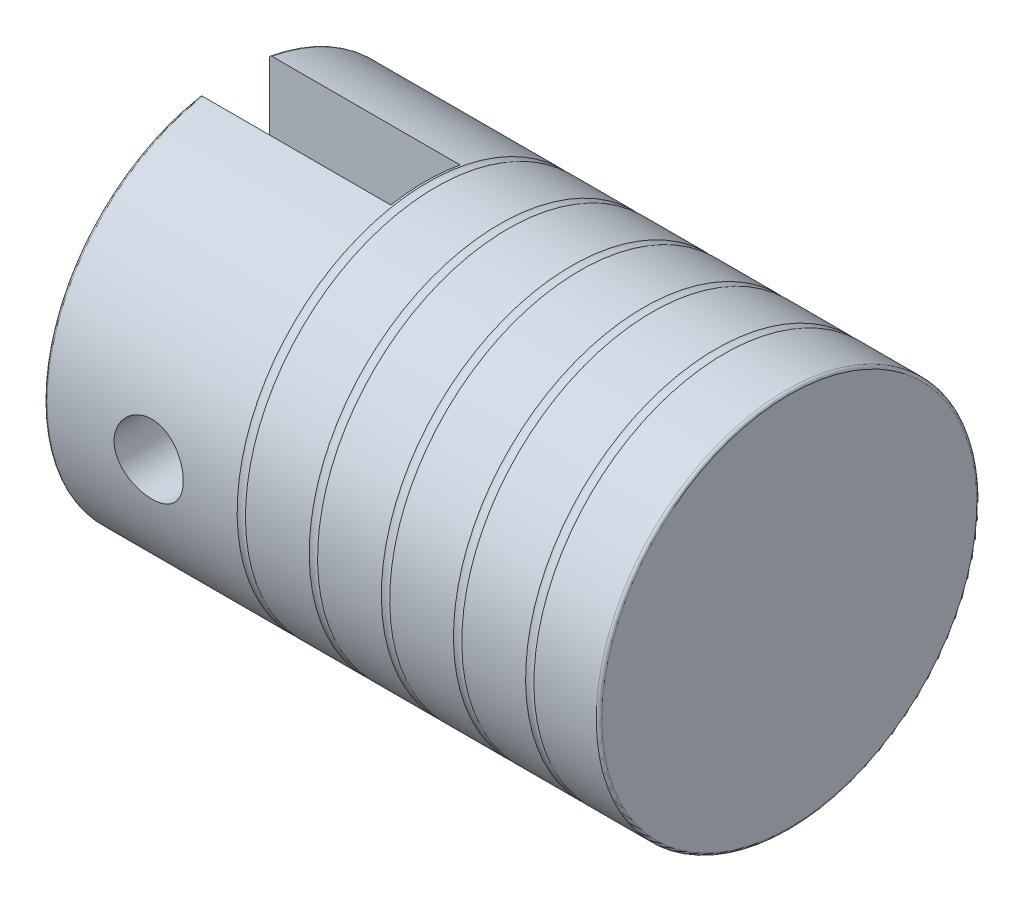
ISO-10303-21;
HEADER;
FILE_DESCRIPTION(('STEP AP214'),'2;1');
FILE_NAME('part.step','',(''),(''),'','','');
FILE_SCHEMA(('AUTOMOTIVE_DESIGN { 1 0 10303 214 1 1 1 1 }'));
ENDSEC;
DATA;
#1=APPLICATION_CONTEXT('core data for automotive mechanical design processes');
#2=APPLICATION_PROTOCOL_DEFINITION('international standard','automotive_design',2000,#1);
#3=PRODUCT_CONTEXT('',#1,'mechanical');
#4=PRODUCT('Part','Part','',(#3));
#5=PRODUCT_RELATED_PRODUCT_CATEGORY('part','',(#4));
#6=PRODUCT_DEFINITION_FORMATION('','',#4);
#7=PRODUCT_DEFINITION_CONTEXT('part definition',#1,'design');
#8=PRODUCT_DEFINITION('design','',#6,#7);
#9=PRODUCT_DEFINITION_SHAPE('','',#8);
#10=(LENGTH_UNIT() NAMED_UNIT(*) SI_UNIT(.MILLI.,.METRE.));
#11=(NAMED_UNIT(*) PLANE_ANGLE_UNIT() SI_UNIT($,.RADIAN.));
#12=(NAMED_UNIT(*) SI_UNIT($,.STERADIAN.) SOLID_ANGLE_UNIT());
#13=UNCERTAINTY_MEASURE_WITH_UNIT(LENGTH_MEASURE(1.E-05),#10,'distance_accuracy_value','');
#14=(GEOMETRIC_REPRESENTATION_CONTEXT(3) GLOBAL_UNCERTAINTY_ASSIGNED_CONTEXT((#13)) GLOBAL_UNIT_ASSIGNED_CONTEXT((#10,
#11,#12)) REPRESENTATION_CONTEXT('',''));
#15=CARTESIAN_POINT('',(0.,0.,0.));
#16=DIRECTION('',(0.,0.,1.));
#17=DIRECTION('',(1.,0.,0.));
#18=AXIS2_PLACEMENT_3D('',#15,#16,#17);
#19=CARTESIAN_POINT('',(0.,0.,0.));
#20=DIRECTION('',(-1.,0.,0.));
#21=DIRECTION('',(0.,-1.,0.));
#22=AXIS2_PLACEMENT_3D('',#19,#20,#21);
#23=CYLINDRICAL_SURFACE('',#22,8.71220000000004);
#24=CARTESIAN_POINT('',(6.35889,0.,8.71220000000004));
#25=CARTESIAN_POINT('',(6.35888657993912,-0.0881780350962883,8.71219842221285));
#26=CARTESIAN_POINT('',(6.35150063813652,-0.176401140000684,8.7108474397148));
#27=CARTESIAN_POINT('',(6.32216911079884,-0.350364612464317,8.70558828160361));
#28=CARTESIAN_POINT('',(6.30021092250165,-0.436102763873023,8.70167789253592));
#29=CARTESIAN_POINT('',(6.24242672621113,-0.602554988759746,8.6917376844555));
#30=CARTESIAN_POINT('',(6.20661290730397,-0.683273405956936,8.68570972873771));
#31=CARTESIAN_POINT('',(6.12216792701397,-0.837547426218977,8.67219392795744));
#32=CARTESIAN_POINT('',(6.07353792454137,-0.911103676103451,8.66470621491021));
#33=CARTESIAN_POINT('',(5.964257990526,-1.04980387004279,8.64900388999731));
#34=CARTESIAN_POINT('',(5.90349152990364,-1.1148552669263,8.64078269565771));
#35=CARTESIAN_POINT('',(5.77191434182633,-1.23389889424259,8.6245892741744));
#36=CARTESIAN_POINT('',(5.70110291944321,-1.28789035889764,8.61661706430246));
#37=CARTESIAN_POINT('',(5.5507970173867,-1.38366245615154,8.60176036132886));
#38=CARTESIAN_POINT('',(5.47124211266623,-1.42534969012656,8.59488436147924));
#39=CARTESIAN_POINT('',(5.30611243032872,-1.49473226319188,8.58309097778229));
#40=CARTESIAN_POINT('',(5.22053813995583,-1.52242873329475,8.57817343562017));
#41=CARTESIAN_POINT('',(5.0467865365023,-1.56274808974622,8.57091981410445));
#42=CARTESIAN_POINT('',(4.95864774445936,-1.57553192603814,8.56855619157597));
#43=CARTESIAN_POINT('',(4.78144698268107,-1.58616255242033,8.56659491393983));
#44=CARTESIAN_POINT('',(4.6923850913385,-1.58401060069801,8.5669970258473));
#45=CARTESIAN_POINT('',(4.51702740126921,-1.56496141430328,8.57049668583428));
#46=CARTESIAN_POINT('',(4.4307110272405,-1.54824655987175,8.57356089349336));
#47=CARTESIAN_POINT('',(4.26212844974995,-1.50083297563626,8.58198717001298));
#48=CARTESIAN_POINT('',(4.17986240912802,-1.47013368410886,8.58734933117665));
#49=CARTESIAN_POINT('',(4.02117856943023,-1.3954424442769,8.59980252056464));
#50=CARTESIAN_POINT('',(3.94479649912633,-1.35137625774107,8.60690316049756));
#51=CARTESIAN_POINT('',(3.80044191774612,-1.25125466567014,8.62202680162168));
#52=CARTESIAN_POINT('',(3.73247021140459,-1.19519811425066,8.63004989093478));
#53=CARTESIAN_POINT('',(3.60581150866763,-1.07170074561807,8.64626005911602));
#54=CARTESIAN_POINT('',(3.547276731459,-1.00410379139383,8.65444780819194));
#55=CARTESIAN_POINT('',(3.44235569908062,-0.859968503234779,8.66995549589927));
#56=CARTESIAN_POINT('',(3.39596955223443,-0.783430089582038,8.67727542679244));
#57=CARTESIAN_POINT('',(3.31664255588323,-0.623430227827684,8.69023617958309));
#58=CARTESIAN_POINT('',(3.2837168551586,-0.539961106061651,8.69587510770943));
#59=CARTESIAN_POINT('',(3.23239566095612,-0.36855170612559,8.70482372402951));
#60=CARTESIAN_POINT('',(3.2139987181022,-0.280611874881426,8.7081336445594));
#61=CARTESIAN_POINT('',(3.19246755367666,-0.104067618494153,8.71201958636721));
#62=CARTESIAN_POINT('',(3.18912465553183,-0.0154894387620692,8.71263298352303));
#63=CARTESIAN_POINT('',(3.19723769545246,0.16096046704421,8.71115975916051));
#64=CARTESIAN_POINT('',(3.2086929518233,0.248832225472917,8.70907326201602));
#65=CARTESIAN_POINT('',(3.24590360312871,0.42071798931342,8.70245792234148));
#66=CARTESIAN_POINT('',(3.27155405805748,0.504755462696955,8.69794700961787));
#67=CARTESIAN_POINT('',(3.33631390779904,0.667337235263273,8.68698652691297));
#68=CARTESIAN_POINT('',(3.37542417292065,0.745881178840195,8.68053683157375));
#69=CARTESIAN_POINT('',(3.46645989012655,0.896141446901156,8.66632103390036));
#70=CARTESIAN_POINT('',(3.51851366583025,0.967778778987808,8.65854200987678));
#71=CARTESIAN_POINT('',(3.63378433035608,1.10137632489634,8.64256525295958));
#72=CARTESIAN_POINT('',(3.69700219473423,1.16333569213238,8.63436748351908));
#73=CARTESIAN_POINT('',(3.83374879869752,1.27660593245484,8.61835406808897));
#74=CARTESIAN_POINT('',(3.90739599452875,1.32777478868893,8.61054444248161));
#75=CARTESIAN_POINT('',(4.06236316494509,1.41701492961941,8.59631014426014));
#76=CARTESIAN_POINT('',(4.14368286522168,1.45508668233948,8.58988542215971));
#77=CARTESIAN_POINT('',(4.31131571098341,1.5168473628361,8.57919502348117));
#78=CARTESIAN_POINT('',(4.39760362017968,1.54060297761762,8.57491935197545));
#79=CARTESIAN_POINT('',(4.57303049144875,1.57326400404161,8.56898766486009));
#80=CARTESIAN_POINT('',(4.66216915229242,1.58217097943932,8.56733137339654));
#81=CARTESIAN_POINT('',(4.83934599340483,1.58483203204447,8.56683937749146));
#82=CARTESIAN_POINT('',(4.92738077412237,1.5788099773209,8.56796200148462));
#83=CARTESIAN_POINT('',(5.10116123851881,1.55227230843146,8.57280925004439));
#84=CARTESIAN_POINT('',(5.18690693396287,1.53175676877241,8.57653386123493));
#85=CARTESIAN_POINT('',(5.35356444936173,1.476906512074,8.58614834889876));
#86=CARTESIAN_POINT('',(5.43448400260603,1.44259462457345,8.592034646928));
#87=CARTESIAN_POINT('',(5.58945389617563,1.36114968000174,8.60531204502652));
#88=CARTESIAN_POINT('',(5.66350379140644,1.3140157929527,8.6127032425013));
#89=CARTESIAN_POINT('',(5.80375657571704,1.20748057090452,8.62828779013409));
#90=CARTESIAN_POINT('',(5.86983423803703,1.1479157874098,8.63649097295868));
#91=CARTESIAN_POINT('',(5.99113166050738,1.01855168131829,8.65270027657516));
#92=CARTESIAN_POINT('',(6.04634892114377,0.948750009146274,8.66070635163279));
#93=CARTESIAN_POINT('',(6.14478833300657,0.80019350002951,8.67569789672113));
#94=CARTESIAN_POINT('',(6.18790600375019,0.721368486827742,8.68267424436409));
#95=CARTESIAN_POINT('',(6.26021847648167,0.557493868511521,8.69473138736662));
#96=CARTESIAN_POINT('',(6.28942658336653,0.472450301828954,8.69981399312763));
#97=CARTESIAN_POINT('',(6.32704238762218,0.322610596062289,8.70645373872986));
#98=CARTESIAN_POINT('',(6.33896520496152,0.25869968057524,8.70859660586296));
#99=CARTESIAN_POINT('',(6.35489018002525,0.129867311085733,8.71147030138847));
#100=CARTESIAN_POINT('',(6.35889251898179,0.064945880239606,8.71220116208964));
#101=CARTESIAN_POINT('',(6.35889,0.,8.71220000000004));
#102=B_SPLINE_CURVE_WITH_KNOTS('',3,(#24,#25,#26,#27,#28,#29,#30,#31,#32,#33,#34,#35,#36,#37,
#38,#39,#40,#41,#42,#43,#44,#45,#46,#47,#48,#49,#50,#51,#52,#53,#54,#55,#56,#57,#58,#59,#60,#61,
#62,#63,#64,#65,#66,#67,#68,#69,#70,#71,#72,#73,#74,#75,#76,#77,#78,#79,#80,#81,#82,#83,#84,#85,
#86,#87,#88,#89,#90,#91,#92,#93,#94,#95,#96,#97,#98,#99,#100,#101),.UNSPECIFIED.,.T.,.F.,(4,2,2,
2,2,2,2,2,2,2,2,2,2,2,2,2,2,2,2,2,2,2,2,2,2,2,2,2,2,2,2,2,2,2,2,2,2,2,4),(0.,0.264296627695332,
0.52882212990661,0.793115450757916,1.05738488093976,1.3243255523839,1.59128470026875,
1.86022102624334,2.12913560793972,2.39512016367275,2.66108231319878,2.92376076877578,
3.18644977648712,3.45062530495584,3.71482609120244,3.98293510683311,4.25104651298281,
4.51945883435895,4.78784437577523,5.05249791681089,5.31713926670016,5.57984985891462,
5.84257744113974,6.10802154086702,6.37348884748954,6.6422577213408,6.91101698976578,
7.17851445530048,7.4459837480862,7.70946653886673,7.97294797516844,8.23599519754972,
8.49905945123305,8.76582925955849,9.03266039311265,9.30172930351162,9.5705403222379,
9.7652075076045,9.95987023864936),.UNSPECIFIED.);
#103=CARTESIAN_POINT('',(6.35889,0.,8.71220000000004));
#104=VERTEX_POINT('',#103);
#105=EDGE_CURVE('E231',#104,#104,#102,.T.);
#106=ORIENTED_EDGE('',*,*,#105,.T.);
#107=EDGE_LOOP('',(#106));
#108=FACE_BOUND('',#107,.T.);
#109=CARTESIAN_POINT('',(8.82650000000008,0.,0.));
#110=DIRECTION('',(-1.,0.,0.));
#111=DIRECTION('',(0.,-1.,0.));
#112=AXIS2_PLACEMENT_3D('',#109,#110,#111);
#113=CIRCLE('',#112,8.7122);
#114=CARTESIAN_POINT('',(8.82650000000014,-8.71219999999994,0.));
#115=VERTEX_POINT('',#114);
#116=EDGE_CURVE('E244',#115,#115,#113,.T.);
#117=ORIENTED_EDGE('',*,*,#116,.T.);
#118=EDGE_LOOP('',(#117));
#119=FACE_BOUND('',#118,.T.);
#120=CARTESIAN_POINT('',(3.175,0.,-8.71220000000015));
#121=CARTESIAN_POINT('',(3.17500343859348,-0.0890810154218983,-8.71219839925246));
#122=CARTESIAN_POINT('',(3.18246366863994,-0.178207155163992,-8.71081960810333));
#123=CARTESIAN_POINT('',(3.21208957475638,-0.353950177902064,-8.70545220781347));
#124=CARTESIAN_POINT('',(3.23426787550828,-0.440564840006631,-8.70146135817439));
#125=CARTESIAN_POINT('',(3.29262978627273,-0.608717667290271,-8.69131649876752));
#126=CARTESIAN_POINT('',(3.32880097521795,-0.690260260484486,-8.68516440791258));
#127=CARTESIAN_POINT('',(3.41408714680375,-0.846111183762068,-8.67136975487537));
#128=CARTESIAN_POINT('',(3.46320099939333,-0.920420144653674,-8.66372732283303));
#129=CARTESIAN_POINT('',(3.57357881985417,-1.06055804140212,-8.64769784853599));
#130=CARTESIAN_POINT('',(3.63496284447047,-1.12629164075717,-8.63930394120116));
#131=CARTESIAN_POINT('',(3.76788024496405,-1.24658835536192,-8.62276881644721));
#132=CARTESIAN_POINT('',(3.83941433156841,-1.30115068772363,-8.61462761677186));
#133=CARTESIAN_POINT('',(3.99127143843675,-1.39794982342224,-8.59945301682811));
#134=CARTESIAN_POINT('',(4.07165691181394,-1.44009016144301,-8.59242847234932));
#135=CARTESIAN_POINT('',(4.23851685811677,-1.51023169532757,-8.58037899504125));
#136=CARTESIAN_POINT('',(4.3249908274154,-1.53823405909154,-8.57535389705033));
#137=CARTESIAN_POINT('',(4.50055474740938,-1.57899984928511,-8.56794123769347));
#138=CARTESIAN_POINT('',(4.58960492837745,-1.59192922862983,-8.56552497545905));
#139=CARTESIAN_POINT('',(4.76864094310367,-1.60269703294244,-8.56351698355482));
#140=CARTESIAN_POINT('',(4.85862669571746,-1.60053675594777,-8.56392501093488));
#141=CARTESIAN_POINT('',(5.03578059823769,-1.58132125246994,-8.56749335093391));
#142=CARTESIAN_POINT('',(5.12296997282163,-1.56445429120521,-8.5706188745414));
#143=CARTESIAN_POINT('',(5.2932599936348,-1.51660050046416,-8.57921543206865));
#144=CARTESIAN_POINT('',(5.37636047234542,-1.48561309301788,-8.58468656199687));
#145=CARTESIAN_POINT('',(5.53666708305662,-1.4102126221209,-8.59739447463255));
#146=CARTESIAN_POINT('',(5.61383643927297,-1.36572312668345,-8.60464126269567));
#147=CARTESIAN_POINT('',(5.75968556027491,-1.26463546770606,-8.6200772844391));
#148=CARTESIAN_POINT('',(5.82836449614467,-1.20803612335785,-8.62826660998843));
#149=CARTESIAN_POINT('',(5.95637137683152,-1.08331830903141,-8.6448168101471));
#150=CARTESIAN_POINT('',(6.01554235288752,-1.01503871162569,-8.65317840717349));
#151=CARTESIAN_POINT('',(6.12161322507292,-0.869438865819215,-8.66901717025059));
#152=CARTESIAN_POINT('',(6.16851300741391,-0.792118533595103,-8.67649432809971));
#153=CARTESIAN_POINT('',(6.24873159407329,-0.630471428166474,-8.68973592347503));
#154=CARTESIAN_POINT('',(6.28203454596097,-0.546136613885513,-8.69549835971218));
#155=CARTESIAN_POINT('',(6.33395793664999,-0.372940581433076,-8.7046456762418));
#156=CARTESIAN_POINT('',(6.35257987118779,-0.28407982535748,-8.70803079873672));
#157=CARTESIAN_POINT('',(6.37439523003346,-0.105705267904563,-8.71200894228315));
#158=CARTESIAN_POINT('',(6.37780380384423,-0.0162186192013688,-8.7126408959544));
#159=CARTESIAN_POINT('',(6.36967212498367,0.162046138454502,-8.71114886674343));
#160=CARTESIAN_POINT('',(6.358132575926,0.250824280558941,-8.70902501357804));
#161=CARTESIAN_POINT('',(6.32061111364298,0.42447294502914,-8.70228422363697));
#162=CARTESIAN_POINT('',(6.29473761537771,0.50936768337674,-8.69768600911504));
#163=CARTESIAN_POINT('',(6.22939969324541,0.673614387275542,-8.68650993958429));
#164=CARTESIAN_POINT('',(6.18993437598368,0.752965988062002,-8.67993195444809));
#165=CARTESIAN_POINT('',(6.09805372824825,0.904795273267943,-8.6654289166878));
#166=CARTESIAN_POINT('',(6.04550636915819,0.977191747912077,-8.65749040473461));
#167=CARTESIAN_POINT('',(5.92913248480874,1.11221633553097,-8.64118264336408));
#168=CARTESIAN_POINT('',(5.86530495176578,1.17484357476916,-8.63281335550812));
#169=CARTESIAN_POINT('',(5.72721020750247,1.28936564749491,-8.61645877464645));
#170=CARTESIAN_POINT('',(5.65282059782916,1.341113925544,-8.60847971565279));
#171=CARTESIAN_POINT('',(5.4962780236366,1.43138005601803,-8.59393268753321));
#172=CARTESIAN_POINT('',(5.41412534040118,1.46989838757689,-8.58736466730854));
#173=CARTESIAN_POINT('',(5.24476792166285,1.53240123783056,-8.57643189043931));
#174=CARTESIAN_POINT('',(5.15758908266361,1.55645403402787,-8.57205679971674));
#175=CARTESIAN_POINT('',(4.98034000640754,1.5895545053612,-8.56598117585487));
#176=CARTESIAN_POINT('',(4.89027008178702,1.59860379741149,-8.56428035451297));
#177=CARTESIAN_POINT('',(4.71126266980922,1.60138799244302,-8.5637600454378));
#178=CARTESIAN_POINT('',(4.62232882026598,1.59535396783307,-8.56489708205878));
#179=CARTESIAN_POINT('',(4.44676586649087,1.56864751058773,-8.56982818631066));
#180=CARTESIAN_POINT('',(4.36013674979423,1.54797515713801,-8.57362223956851));
#181=CARTESIAN_POINT('',(4.1917599507834,1.49267466488985,-8.58342191276151));
#182=CARTESIAN_POINT('',(4.11000413595306,1.45807056895916,-8.58942372110486));
#183=CARTESIAN_POINT('',(3.95342154483761,1.37591382306021,-8.60296552049258));
#184=CARTESIAN_POINT('',(3.87859523104966,1.32836030963971,-8.61050561409963));
#185=CARTESIAN_POINT('',(3.73683624869438,1.22084713504989,-8.62640992000747));
#186=CARTESIAN_POINT('',(3.67003253158836,1.16071894204314,-8.63478442202249));
#187=CARTESIAN_POINT('',(3.54738558168418,1.03011552828716,-8.65133601257922));
#188=CARTESIAN_POINT('',(3.49154487132264,0.959637932788239,-8.6595130553096));
#189=CARTESIAN_POINT('',(3.39196274219659,0.809612127980677,-8.67483059841685));
#190=CARTESIAN_POINT('',(3.34832934039479,0.729991224375814,-8.68196159480117));
#191=CARTESIAN_POINT('',(3.27512764415302,0.564444856476086,-8.69429089665788));
#192=CARTESIAN_POINT('',(3.24554598414575,0.478525473270183,-8.69949103766585));
#193=CARTESIAN_POINT('',(3.20737414030399,0.326947627520998,-8.70629807029575));
#194=CARTESIAN_POINT('',(3.19525433051983,0.262181630303912,-8.70849892510214));
#195=CARTESIAN_POINT('',(3.17906608537998,0.131618617885182,-8.71145046416571));
#196=CARTESIAN_POINT('',(3.17499745923621,0.0658216271521276,-8.7122011827866));
#197=CARTESIAN_POINT('',(3.175,0.,-8.71220000000015));
#198=B_SPLINE_CURVE_WITH_KNOTS('',3,(#120,#121,#122,#123,#124,#125,#126,#127,#128,#129,#130,
#131,#132,#133,#134,#135,#136,#137,#138,#139,#140,#141,#142,#143,#144,#145,#146,#147,#148,#149,
#150,#151,#152,#153,#154,#155,#156,#157,#158,#159,#160,#161,#162,#163,#164,#165,#166,#167,#168,
#169,#170,#171,#172,#173,#174,#175,#176,#177,#178,#179,#180,#181,#182,#183,#184,#185,#186,#187,
#188,#189,#190,#191,#192,#193,#194,#195,#196,#197),.UNSPECIFIED.,.T.,.F.,(4,2,2,2,2,2,2,2,2,2,2,
2,2,2,2,2,2,2,2,2,2,2,2,2,2,2,2,2,2,2,2,2,2,2,2,2,2,2,4),(0.,0.267002355289124,
0.534234033046128,0.801229039559466,1.06820074190067,1.33792515423079,1.60766846251778,
1.87945443262966,2.15121794755603,2.41996022293412,2.68867938093745,2.95400825763615,
3.21934799559922,3.48621869536859,3.75311542905994,4.02404485687404,4.29497679687513,
4.56622371827456,4.83744300082924,5.1048142536373,5.37217292163914,5.63753649523329,
5.90291751459154,6.17109389232241,6.43929424135885,6.71090405880369,6.98250403862717,
7.25281179136189,7.52309041137688,7.78925388723672,8.0554159233031,8.32112058267792,
8.58684296327333,8.85638558334575,9.12599014896063,9.39790986768553,9.669570424588,
9.86686213564486,10.0641491714441),.UNSPECIFIED.);
#199=CARTESIAN_POINT('',(3.175,0.,-8.71220000000015));
#200=VERTEX_POINT('',#199);
#201=EDGE_CURVE('E123',#200,#200,#198,.T.);
#202=ORIENTED_EDGE('',*,*,#201,.T.);
#203=EDGE_LOOP('',(#202));
#204=FACE_BOUND('',#203,.T.);
#205=DIRECTION('',(-1.,0.,0.));
#206=VECTOR('',#205,1.);
#207=CARTESIAN_POINT('',(0.,-8.56634534617889,-1.5875));
#208=LINE('',#207,#206);
#209=CARTESIAN_POINT('',(8.7376,-8.56634534617883,-1.5875));
#210=VERTEX_POINT('',#209);
#211=CARTESIAN_POINT('',(0.127000000000091,-8.56634534617889,-1.5875));
#212=VERTEX_POINT('',#211);
#213=EDGE_CURVE('E93',#210,#212,#208,.T.);
#214=ORIENTED_EDGE('',*,*,#213,.T.);
#215=CARTESIAN_POINT('',(0.127000000000031,0.,0.));
#216=DIRECTION('',(-1.,0.,0.));
#217=DIRECTION('',(0.,-1.,0.));
#218=AXIS2_PLACEMENT_3D('',#215,#216,#217);
#219=CIRCLE('',#218,8.71220000000004);
#220=CARTESIAN_POINT('',(0.126999999999971,8.56634534617889,-1.5875));
#221=VERTEX_POINT('',#220);
#222=EDGE_CURVE('E316',#212,#221,#219,.F.);
#223=ORIENTED_EDGE('',*,*,#222,.T.);
#224=DIRECTION('',(-1.,0.,0.));
#225=VECTOR('',#224,1.);
#226=CARTESIAN_POINT('',(0.,8.56634534617889,-1.5875));
#227=LINE('',#226,#225);
#228=CARTESIAN_POINT('',(8.7376,8.56634534617895,-1.5875));
#229=VERTEX_POINT('',#228);
#230=EDGE_CURVE('E103',#221,#229,#227,.F.);
#231=ORIENTED_EDGE('',*,*,#230,.T.);
#232=CARTESIAN_POINT('',(8.7376,0.,0.));
#233=DIRECTION('',(1.,0.,0.));
#234=DIRECTION('',(0.,0.,-1.));
#235=AXIS2_PLACEMENT_3D('',#232,#233,#234);
#236=CIRCLE('',#235,8.71220000000004);
#237=CARTESIAN_POINT('',(8.7376,8.56634534617895,1.5875));
#238=VERTEX_POINT('',#237);
#239=EDGE_CURVE('E114',#238,#229,#236,.F.);
#240=ORIENTED_EDGE('',*,*,#239,.F.);
#241=DIRECTION('',(-1.,0.,0.));
#242=VECTOR('',#241,1.);
#243=CARTESIAN_POINT('',(0.,8.56634534617889,1.5875));
#244=LINE('',#243,#242);
#245=CARTESIAN_POINT('',(0.126999999999971,8.56634534617889,1.5875));
#246=VERTEX_POINT('',#245);
#247=EDGE_CURVE('E319',#238,#246,#244,.T.);
#248=ORIENTED_EDGE('',*,*,#247,.T.);
#249=CARTESIAN_POINT('',(0.127000000000031,0.,0.));
#250=DIRECTION('',(-1.,0.,0.));
#251=DIRECTION('',(0.,-1.,0.));
#252=AXIS2_PLACEMENT_3D('',#249,#250,#251);
#253=CIRCLE('',#252,8.71220000000004);
#254=CARTESIAN_POINT('',(0.127000000000091,-8.56634534617889,1.5875));
#255=VERTEX_POINT('',#254);
#256=EDGE_CURVE('E317',#246,#255,#253,.F.);
#257=ORIENTED_EDGE('',*,*,#256,.T.);
#258=DIRECTION('',(-1.,0.,0.));
#259=VECTOR('',#258,1.);
#260=CARTESIAN_POINT('',(0.,-8.56634534617889,1.5875));
#261=LINE('',#260,#259);
#262=CARTESIAN_POINT('',(8.7376,-8.56634534617883,1.5875));
#263=VERTEX_POINT('',#262);
#264=EDGE_CURVE('E117',#255,#263,#261,.F.);
#265=ORIENTED_EDGE('',*,*,#264,.T.);
#266=EDGE_CURVE('E111',#210,#263,#236,.F.);
#267=ORIENTED_EDGE('',*,*,#266,.F.);
#268=EDGE_LOOP('',(#214,#223,#231,#240,#248,#257,#265,#267));
#269=FACE_BOUND('',#268,.T.);
#270=ADVANCED_FACE('F35',(#108,#119,#204,#269),#23,.T.);
#271=CARTESIAN_POINT('',(0.,0.,0.));
#272=DIRECTION('',(-1.,0.,0.));
#273=DIRECTION('',(0.,-1.,0.));
#274=AXIS2_PLACEMENT_3D('',#271,#272,#273);
#275=PLANE('',#274);
#276=DIRECTION('',(0.,-1.,0.));
#277=VECTOR('',#276,1.);
#278=CARTESIAN_POINT('',(0.,-12.6999999999999,1.5875));
#279=LINE('',#278,#277);
#280=CARTESIAN_POINT('',(0.,8.43715015808067,1.5875));
#281=VERTEX_POINT('',#280);
#282=CARTESIAN_POINT('',(0.,-8.43715015808067,1.5875));
#283=VERTEX_POINT('',#282);
#284=EDGE_CURVE('E321',#281,#283,#279,.T.);
#285=ORIENTED_EDGE('',*,*,#284,.T.);
#286=CARTESIAN_POINT('',(0.,0.,0.));
#287=DIRECTION('',(-1.,0.,0.));
#288=DIRECTION('',(0.,-1.,0.));
#289=AXIS2_PLACEMENT_3D('',#286,#287,#288);
#290=CIRCLE('',#289,8.58520000000004);
#291=EDGE_CURVE('E314',#283,#281,#290,.T.);
#292=ORIENTED_EDGE('',*,*,#291,.T.);
#293=EDGE_LOOP('',(#285,#292));
#294=FACE_BOUND('',#293,.T.);
#295=ADVANCED_FACE('F204',(#294),#275,.T.);
#296=DIRECTION('',(0.,1.,0.));
#297=VECTOR('',#296,1.);
#298=CARTESIAN_POINT('',(0.,-12.6999999999999,-1.5875));
#299=LINE('',#298,#297);
#300=CARTESIAN_POINT('',(0.,-8.43715015808067,-1.5875));
#301=VERTEX_POINT('',#300);
#302=CARTESIAN_POINT('',(0.,8.43715015808067,-1.5875));
#303=VERTEX_POINT('',#302);
#304=EDGE_CURVE('E322',#301,#303,#299,.T.);
#305=ORIENTED_EDGE('',*,*,#304,.T.);
#306=CARTESIAN_POINT('',(0.,0.,0.));
#307=DIRECTION('',(-1.,0.,0.));
#308=DIRECTION('',(0.,-1.,0.));
#309=AXIS2_PLACEMENT_3D('',#306,#307,#308);
#310=CIRCLE('',#309,8.58520000000004);
#311=EDGE_CURVE('E130',#303,#301,#310,.T.);
#312=ORIENTED_EDGE('',*,*,#311,.T.);
#313=EDGE_LOOP('',(#305,#312));
#314=FACE_BOUND('',#313,.T.);
#315=ADVANCED_FACE('F218',(#314),#275,.T.);
#316=CARTESIAN_POINT('',(4.7752,0.,5.08));
#317=DIRECTION('',(0.,0.,-1.));
#318=DIRECTION('',(-1.,0.,0.));
#319=AXIS2_PLACEMENT_3D('',#316,#317,#318);
#320=CYLINDRICAL_SURFACE('',#319,1.6002);
#321=CARTESIAN_POINT('',(4.7752,0.,5.08));
#322=DIRECTION('',(0.,0.,1.));
#323=DIRECTION('',(1.,0.,0.));
#324=AXIS2_PLACEMENT_3D('',#321,#322,#323);
#325=CIRCLE('',#324,1.6002);
#326=CARTESIAN_POINT('',(6.3754,0.,5.08));
#327=VERTEX_POINT('',#326);
#328=EDGE_CURVE('E241',#327,#327,#325,.T.);
#329=ORIENTED_EDGE('',*,*,#328,.T.);
#330=EDGE_LOOP('',(#329));
#331=FACE_BOUND('',#330,.T.);
#332=CARTESIAN_POINT('',(4.7752,0.,1.5875));
#333=DIRECTION('',(0.,0.,-1.));
#334=DIRECTION('',(-1.,0.,0.));
#335=AXIS2_PLACEMENT_3D('',#332,#333,#334);
#336=CIRCLE('',#335,1.6002);
#337=CARTESIAN_POINT('',(3.175,0.,1.5875));
#338=VERTEX_POINT('',#337);
#339=EDGE_CURVE('E125',#338,#338,#336,.T.);
#340=ORIENTED_EDGE('',*,*,#339,.T.);
#341=EDGE_LOOP('',(#340));
#342=FACE_BOUND('',#341,.T.);
#343=ADVANCED_FACE('F214',(#331,#342),#320,.F.);
#344=ORIENTED_EDGE('',*,*,#201,.F.);
#345=EDGE_LOOP('',(#344));
#346=FACE_BOUND('',#345,.T.);
#347=CARTESIAN_POINT('',(4.7752,0.,-1.5875));
#348=DIRECTION('',(0.,0.,1.));
#349=DIRECTION('',(1.,0.,0.));
#350=AXIS2_PLACEMENT_3D('',#347,#348,#349);
#351=CIRCLE('',#350,1.6002);
#352=CARTESIAN_POINT('',(6.3754,0.,-1.5875));
#353=VERTEX_POINT('',#352);
#354=EDGE_CURVE('E104',#353,#353,#351,.T.);
#355=ORIENTED_EDGE('',*,*,#354,.T.);
#356=EDGE_LOOP('',(#355));
#357=FACE_BOUND('',#356,.T.);
#358=ADVANCED_FACE('F159',(#346,#357),#320,.F.);
#359=CARTESIAN_POINT('',(25.4000000000003,1.77367252013233E-13,0.));
#360=DIRECTION('',(-1.,0.,0.));
#361=DIRECTION('',(0.,-1.,0.));
#362=AXIS2_PLACEMENT_3D('',#359,#360,#361);
#363=PLANE('',#362);
#364=CARTESIAN_POINT('',(25.4000000000003,1.77367252013233E-13,0.));
#365=DIRECTION('',(-1.,0.,0.));
#366=DIRECTION('',(0.,-1.,0.));
#367=AXIS2_PLACEMENT_3D('',#364,#365,#366);
#368=CIRCLE('',#367,8.58520000000012);
#369=CARTESIAN_POINT('',(25.4000000000004,-8.58519999999994,0.));
#370=VERTEX_POINT('',#369);
#371=EDGE_CURVE('E121',#370,#370,#368,.F.);
#372=ORIENTED_EDGE('',*,*,#371,.T.);
#373=EDGE_LOOP('',(#372));
#374=FACE_BOUND('',#373,.T.);
#375=ADVANCED_FACE('F155',(#374),#363,.F.);
#376=CARTESIAN_POINT('',(0.,0.,0.));
#377=DIRECTION('',(-1.,0.,0.));
#378=DIRECTION('',(0.,-1.,0.));
#379=AXIS2_PLACEMENT_3D('',#376,#377,#378);
#380=CYLINDRICAL_SURFACE('',#379,8.71220000000012);
#381=CARTESIAN_POINT('',(25.2730000000003,1.76480415753167E-13,0.));
#382=DIRECTION('',(-1.,0.,0.));
#383=DIRECTION('',(0.,-1.,0.));
#384=AXIS2_PLACEMENT_3D('',#381,#382,#383);
#385=CIRCLE('',#384,8.71220000000012);
#386=CARTESIAN_POINT('',(25.2730000000004,-8.71219999999994,0.));
#387=VERTEX_POINT('',#386);
#388=EDGE_CURVE('E118',#387,#387,#385,.T.);
#389=ORIENTED_EDGE('',*,*,#388,.T.);
#390=EDGE_LOOP('',(#389));
#391=FACE_BOUND('',#390,.T.);
#392=CARTESIAN_POINT('',(22.4155000000003,1.56526599901679E-13,0.));
#393=DIRECTION('',(-1.,0.,0.));
#394=DIRECTION('',(0.,-1.,0.));
#395=AXIS2_PLACEMENT_3D('',#392,#393,#394);
#396=CIRCLE('',#395,8.71220000000008);
#397=CARTESIAN_POINT('',(22.4155000000004,-8.71219999999993,0.));
#398=VERTEX_POINT('',#397);
#399=EDGE_CURVE('E212',#398,#398,#396,.T.);
#400=ORIENTED_EDGE('',*,*,#399,.F.);
#401=EDGE_LOOP('',(#400));
#402=FACE_BOUND('',#401,.T.);
#403=ADVANCED_FACE('F158',(#391,#402),#380,.T.);
#404=CARTESIAN_POINT('',(22.2250000000003,1.54390389361936E-13,0.));
#405=DIRECTION('',(-1.,0.,0.));
#406=DIRECTION('',(0.,-1.,0.));
#407=AXIS2_PLACEMENT_3D('',#404,#405,#406);
#408=TOROIDAL_SURFACE('',#407,9.04215567884195,0.380999999999999);
#409=ORIENTED_EDGE('',*,*,#399,.T.);
#410=EDGE_LOOP('',(#409));
#411=FACE_BOUND('',#410,.T.);
#412=CARTESIAN_POINT('',(22.0345000000003,1.5386609112148E-13,0.));
#413=DIRECTION('',(-1.,0.,0.));
#414=DIRECTION('',(0.,-1.,0.));
#415=AXIS2_PLACEMENT_3D('',#412,#413,#414);
#416=CIRCLE('',#415,8.71220000000008);
#417=CARTESIAN_POINT('',(22.0345000000004,-8.71219999999993,0.));
#418=VERTEX_POINT('',#417);
#419=EDGE_CURVE('E267',#418,#418,#416,.T.);
#420=ORIENTED_EDGE('',*,*,#419,.F.);
#421=EDGE_LOOP('',(#420));
#422=FACE_BOUND('',#421,.T.);
#423=ADVANCED_FACE('F163',(#411,#422),#408,.F.);
#424=CARTESIAN_POINT('',(0.,0.,0.));
#425=DIRECTION('',(-1.,0.,0.));
#426=DIRECTION('',(0.,-1.,0.));
#427=AXIS2_PLACEMENT_3D('',#424,#425,#426);
#428=CYLINDRICAL_SURFACE('',#427,8.71220000000004);
#429=ORIENTED_EDGE('',*,*,#419,.T.);
#430=EDGE_LOOP('',(#429));
#431=FACE_BOUND('',#430,.T.);
#432=CARTESIAN_POINT('',(19.1135000000001,1.33468857139957E-13,0.));
#433=DIRECTION('',(-1.,0.,0.));
#434=DIRECTION('',(0.,-1.,0.));
#435=AXIS2_PLACEMENT_3D('',#432,#433,#434);
#436=CIRCLE('',#435,8.7122);
#437=CARTESIAN_POINT('',(19.1135000000001,-8.71219999999987,0.));
#438=VERTEX_POINT('',#437);
#439=EDGE_CURVE('E265',#438,#438,#436,.T.);
#440=ORIENTED_EDGE('',*,*,#439,.F.);
#441=EDGE_LOOP('',(#440));
#442=FACE_BOUND('',#441,.T.);
#443=ADVANCED_FACE('F167',(#431,#442),#428,.T.);
#444=CARTESIAN_POINT('',(18.9230000000001,1.31838984174237E-13,0.));
#445=DIRECTION('',(-1.,0.,0.));
#446=DIRECTION('',(0.,-1.,0.));
#447=AXIS2_PLACEMENT_3D('',#444,#445,#446);
#448=TOROIDAL_SURFACE('',#447,9.04215567884187,0.380999999999998);
#449=ORIENTED_EDGE('',*,*,#439,.T.);
#450=EDGE_LOOP('',(#449));
#451=FACE_BOUND('',#450,.T.);
#452=CARTESIAN_POINT('',(18.7325000000001,1.30808348359759E-13,0.));
#453=DIRECTION('',(-1.,0.,0.));
#454=DIRECTION('',(0.,-1.,0.));
#455=AXIS2_PLACEMENT_3D('',#452,#453,#454);
#456=CIRCLE('',#455,8.7122);
#457=CARTESIAN_POINT('',(18.7325000000001,-8.71219999999987,0.));
#458=VERTEX_POINT('',#457);
#459=EDGE_CURVE('E262',#458,#458,#456,.T.);
#460=ORIENTED_EDGE('',*,*,#459,.F.);
#461=EDGE_LOOP('',(#460));
#462=FACE_BOUND('',#461,.T.);
#463=ADVANCED_FACE('F171',(#451,#462),#448,.F.);
#464=CARTESIAN_POINT('',(0.,0.,0.));
#465=DIRECTION('',(-1.,0.,0.));
#466=DIRECTION('',(0.,-1.,0.));
#467=AXIS2_PLACEMENT_3D('',#464,#465,#466);
#468=CYLINDRICAL_SURFACE('',#467,8.7122);
#469=ORIENTED_EDGE('',*,*,#459,.T.);
#470=EDGE_LOOP('',(#469));
#471=FACE_BOUND('',#470,.T.);
#472=CARTESIAN_POINT('',(15.8115000000001,1.10411114378237E-13,0.));
#473=DIRECTION('',(-1.,0.,0.));
#474=DIRECTION('',(0.,-1.,0.));
#475=AXIS2_PLACEMENT_3D('',#472,#473,#474);
#476=CIRCLE('',#475,8.7122);
#477=CARTESIAN_POINT('',(15.8115000000001,-8.71219999999989,0.));
#478=VERTEX_POINT('',#477);
#479=EDGE_CURVE('E259',#478,#478,#476,.T.);
#480=ORIENTED_EDGE('',*,*,#479,.F.);
#481=EDGE_LOOP('',(#480));
#482=FACE_BOUND('',#481,.T.);
#483=ADVANCED_FACE('F175',(#471,#482),#468,.T.);
#484=CARTESIAN_POINT('',(15.6210000000001,1.09287578986539E-13,0.));
#485=DIRECTION('',(-1.,0.,0.));
#486=DIRECTION('',(0.,-1.,0.));
#487=AXIS2_PLACEMENT_3D('',#484,#485,#486);
#488=TOROIDAL_SURFACE('',#487,9.04215567884187,0.380999999999998);
#489=ORIENTED_EDGE('',*,*,#479,.T.);
#490=EDGE_LOOP('',(#489));
#491=FACE_BOUND('',#490,.T.);
#492=CARTESIAN_POINT('',(15.4305000000001,1.07750605598038E-13,0.));
#493=DIRECTION('',(-1.,0.,0.));
#494=DIRECTION('',(0.,-1.,0.));
#495=AXIS2_PLACEMENT_3D('',#492,#493,#494);
#496=CIRCLE('',#495,8.7122);
#497=CARTESIAN_POINT('',(15.4305000000001,-8.71219999999989,0.));
#498=VERTEX_POINT('',#497);
#499=EDGE_CURVE('E256',#498,#498,#496,.T.);
#500=ORIENTED_EDGE('',*,*,#499,.F.);
#501=EDGE_LOOP('',(#500));
#502=FACE_BOUND('',#501,.T.);
#503=ADVANCED_FACE('F179',(#491,#502),#488,.F.);
#504=CARTESIAN_POINT('',(0.,0.,0.));
#505=DIRECTION('',(-1.,0.,0.));
#506=DIRECTION('',(0.,-1.,0.));
#507=AXIS2_PLACEMENT_3D('',#504,#505,#506);
#508=CYLINDRICAL_SURFACE('',#507,8.71220000000004);
#509=ORIENTED_EDGE('',*,*,#499,.T.);
#510=EDGE_LOOP('',(#509));
#511=FACE_BOUND('',#510,.T.);
#512=CARTESIAN_POINT('',(12.5095,0.,0.));
#513=DIRECTION('',(-1.,0.,0.));
#514=DIRECTION('',(0.,-1.,0.));
#515=AXIS2_PLACEMENT_3D('',#512,#513,#514);
#516=CIRCLE('',#515,8.71220000000008);
#517=CARTESIAN_POINT('',(12.5095000000001,-8.71219999999999,0.));
#518=VERTEX_POINT('',#517);
#519=EDGE_CURVE('E253',#518,#518,#516,.T.);
#520=ORIENTED_EDGE('',*,*,#519,.F.);
#521=EDGE_LOOP('',(#520));
#522=FACE_BOUND('',#521,.T.);
#523=ADVANCED_FACE('F183',(#511,#522),#508,.T.);
#524=CARTESIAN_POINT('',(12.3190000000001,0.,0.));
#525=DIRECTION('',(-1.,0.,0.));
#526=DIRECTION('',(0.,-1.,0.));
#527=AXIS2_PLACEMENT_3D('',#524,#525,#526);
#528=TOROIDAL_SURFACE('',#527,9.04215567884187,0.380999999999902);
#529=ORIENTED_EDGE('',*,*,#519,.T.);
#530=EDGE_LOOP('',(#529));
#531=FACE_BOUND('',#530,.T.);
#532=CARTESIAN_POINT('',(12.1285000000003,0.,0.));
#533=DIRECTION('',(-1.,0.,0.));
#534=DIRECTION('',(0.,-1.,0.));
#535=AXIS2_PLACEMENT_3D('',#532,#533,#534);
#536=CIRCLE('',#535,8.71220000000008);
#537=CARTESIAN_POINT('',(12.1285000000004,-8.7122,0.));
#538=VERTEX_POINT('',#537);
#539=EDGE_CURVE('E250',#538,#538,#536,.T.);
#540=ORIENTED_EDGE('',*,*,#539,.F.);
#541=EDGE_LOOP('',(#540));
#542=FACE_BOUND('',#541,.T.);
#543=ADVANCED_FACE('F187',(#531,#542),#528,.F.);
#544=CARTESIAN_POINT('',(0.,0.,0.));
#545=DIRECTION('',(-1.,0.,0.));
#546=DIRECTION('',(0.,-1.,0.));
#547=AXIS2_PLACEMENT_3D('',#544,#545,#546);
#548=CYLINDRICAL_SURFACE('',#547,8.71220000000009);
#549=ORIENTED_EDGE('',*,*,#539,.T.);
#550=EDGE_LOOP('',(#549));
#551=FACE_BOUND('',#550,.T.);
#552=CARTESIAN_POINT('',(9.2075000000003,0.,0.));
#553=DIRECTION('',(-1.,0.,0.));
#554=DIRECTION('',(0.,-1.,0.));
#555=AXIS2_PLACEMENT_3D('',#552,#553,#554);
#556=CIRCLE('',#555,8.7122000000001);
#557=CARTESIAN_POINT('',(9.20750000000037,-8.71220000000004,0.));
#558=VERTEX_POINT('',#557);
#559=EDGE_CURVE('E247',#558,#558,#556,.T.);
#560=ORIENTED_EDGE('',*,*,#559,.F.);
#561=EDGE_LOOP('',(#560));
#562=FACE_BOUND('',#561,.T.);
#563=ADVANCED_FACE('F191',(#551,#562),#548,.T.);
#564=CARTESIAN_POINT('',(9.01700000000008,0.,0.));
#565=DIRECTION('',(-1.,0.,0.));
#566=DIRECTION('',(0.,-1.,0.));
#567=AXIS2_PLACEMENT_3D('',#564,#565,#566);
#568=TOROIDAL_SURFACE('',#567,9.04215567884187,0.381000000000022);
#569=ORIENTED_EDGE('',*,*,#559,.T.);
#570=EDGE_LOOP('',(#569));
#571=FACE_BOUND('',#570,.T.);
#572=ORIENTED_EDGE('',*,*,#116,.F.);
#573=EDGE_LOOP('',(#572));
#574=FACE_BOUND('',#573,.T.);
#575=ADVANCED_FACE('F195',(#571,#574),#568,.F.);
#576=CARTESIAN_POINT('',(4.7752,0.,5.08));
#577=DIRECTION('',(0.,0.,1.));
#578=DIRECTION('',(1.,0.,0.));
#579=AXIS2_PLACEMENT_3D('',#576,#577,#578);
#580=PLANE('',#579);
#581=CARTESIAN_POINT('',(4.7752,0.,5.08));
#582=DIRECTION('',(0.,0.,1.));
#583=DIRECTION('',(1.,0.,0.));
#584=AXIS2_PLACEMENT_3D('',#581,#582,#583);
#585=CIRCLE('',#584,1.58369);
#586=CARTESIAN_POINT('',(6.35889,0.,5.08));
#587=VERTEX_POINT('',#586);
#588=EDGE_CURVE('E237',#587,#587,#585,.F.);
#589=ORIENTED_EDGE('',*,*,#588,.F.);
#590=EDGE_LOOP('',(#589));
#591=FACE_BOUND('',#590,.T.);
#592=ORIENTED_EDGE('',*,*,#328,.F.);
#593=EDGE_LOOP('',(#592));
#594=FACE_BOUND('',#593,.T.);
#595=ADVANCED_FACE('F199',(#591,#594),#580,.F.);
#596=CARTESIAN_POINT('',(4.7752,0.,-8.71320000000016));
#597=DIRECTION('',(0.,0.,1.));
#598=DIRECTION('',(1.,0.,0.));
#599=AXIS2_PLACEMENT_3D('',#596,#597,#598);
#600=CYLINDRICAL_SURFACE('',#599,1.58369);
#601=ORIENTED_EDGE('',*,*,#105,.F.);
#602=EDGE_LOOP('',(#601));
#603=FACE_BOUND('',#602,.T.);
#604=ORIENTED_EDGE('',*,*,#588,.T.);
#605=EDGE_LOOP('',(#604));
#606=FACE_BOUND('',#605,.T.);
#607=ADVANCED_FACE('F222',(#603,#606),#600,.F.);
#608=CARTESIAN_POINT('',(8.7376,-12.6999999999999,1.5875));
#609=DIRECTION('',(0.,0.,-1.));
#610=DIRECTION('',(-1.,0.,0.));
#611=AXIS2_PLACEMENT_3D('',#608,#609,#610);
#612=PLANE('',#611);
#613=ORIENTED_EDGE('',*,*,#339,.F.);
#614=EDGE_LOOP('',(#613));
#615=FACE_BOUND('',#614,.T.);
#616=ORIENTED_EDGE('',*,*,#284,.F.);
#617=CARTESIAN_POINT('',(0.,8.43715015808067,1.5875));
#618=CARTESIAN_POINT('',(-5.64889389893494E-06,8.44451159436906,1.5875));
#619=CARTESIAN_POINT('',(0.000617850175522828,8.45187200306526,1.5875));
#620=CARTESIAN_POINT('',(0.00308276115265648,8.46638412728512,1.5875));
#621=CARTESIAN_POINT('',(0.00492385129540304,8.47353589742316,1.5875));
#622=CARTESIAN_POINT('',(0.00978521200779885,8.48743281798297,1.5875));
#623=CARTESIAN_POINT('',(0.0128062636866874,8.49417769562906,1.5875));
#624=CARTESIAN_POINT('',(0.0199458432052329,8.50705689800989,1.5875));
#625=CARTESIAN_POINT('',(0.0240640150134033,8.51319141992854,1.5875));
#626=CARTESIAN_POINT('',(0.0332492360253652,8.52462039961882,1.5875));
#627=CARTESIAN_POINT('',(0.0383081767313942,8.52992137036419,1.5875));
#628=CARTESIAN_POINT('',(0.049258783270222,8.53958274282122,1.5875));
#629=CARTESIAN_POINT('',(0.0551505812951461,8.5439429949428,1.5875));
#630=CARTESIAN_POINT('',(0.0674958059368085,8.55152196934643,1.5875));
#631=CARTESIAN_POINT('',(0.073938631153702,8.55475798260971,1.5875));
#632=CARTESIAN_POINT('',(0.0872799586988367,8.56008145171378,1.5875));
#633=CARTESIAN_POINT('',(0.0941780771032193,8.56216986174918,1.5875));
#634=CARTESIAN_POINT('',(0.105440892728687,8.56454713972286,1.5875));
#635=CARTESIAN_POINT('',(0.109727988945716,8.5652210853156,1.5875));
#636=CARTESIAN_POINT('',(0.118342720478325,8.56612006541424,1.5875));
#637=CARTESIAN_POINT('',(0.122670288350479,8.56634574645352,1.5875));
#638=CARTESIAN_POINT('',(0.126999999999916,8.56634534617915,1.5875));
#639=B_SPLINE_CURVE_WITH_KNOTS('',3,(#617,#618,#619,#620,#621,#622,#623,#624,#625,#626,#627,
#628,#629,#630,#631,#632,#633,#634,#635,#636,#637,#638),.UNSPECIFIED.,.F.,.F.,(4,2,2,2,2,2,2,2,
2,2,4),(0.,0.0220566263598006,0.0441074262846004,0.0661728481740675,0.0882311182161732,
0.110107408264099,0.131987174450223,0.153513745819013,0.175022391359118,0.188020221693679,
0.20099929156438),.UNSPECIFIED.);
#640=EDGE_CURVE('E11',#281,#246,#639,.T.);
#641=ORIENTED_EDGE('',*,*,#640,.T.);
#642=ORIENTED_EDGE('',*,*,#247,.F.);
#643=DIRECTION('',(0.,-1.,0.));
#644=VECTOR('',#643,1.);
#645=CARTESIAN_POINT('',(8.7376,-12.6999999999999,1.5875));
#646=LINE('',#645,#644);
#647=EDGE_CURVE('E115',#238,#263,#646,.T.);
#648=ORIENTED_EDGE('',*,*,#647,.T.);
#649=ORIENTED_EDGE('',*,*,#264,.F.);
#650=CARTESIAN_POINT('',(0.127000000000091,-8.56634534617888,1.5875));
#651=CARTESIAN_POINT('',(0.119942090759601,-8.56635190409023,1.5875));
#652=CARTESIAN_POINT('',(0.112886693157118,-8.56574738611668,1.5875));
#653=CARTESIAN_POINT('',(0.0989854821141484,-8.56336542568629,1.5875));
#654=CARTESIAN_POINT('',(0.0921394167806379,-8.56158945606305,1.5875));
#655=CARTESIAN_POINT('',(0.0788406176848601,-8.55691285004028,1.5875));
#656=CARTESIAN_POINT('',(0.0723880099258885,-8.55401185552213,1.5875));
#657=CARTESIAN_POINT('',(0.0600570088292365,-8.54717601635167,1.5875));
#658=CARTESIAN_POINT('',(0.0541785901153681,-8.54324121741656,1.5875));
#659=CARTESIAN_POINT('',(0.0431137506823031,-8.53442209819019,1.5875));
#660=CARTESIAN_POINT('',(0.0379326413637038,-8.52953111742499,1.5875));
#661=CARTESIAN_POINT('',(0.0284486076248949,-8.51896000114522,1.5875));
#662=CARTESIAN_POINT('',(0.0241458772857559,-8.51327969169052,1.5875));
#663=CARTESIAN_POINT('',(0.0164682369873125,-8.5011954085398,1.5875));
#664=CARTESIAN_POINT('',(0.0131093019001096,-8.49478129601481,1.5875));
#665=CARTESIAN_POINT('',(0.00749835582069073,-8.48148697349546,1.5875));
#666=CARTESIAN_POINT('',(0.00524596581256183,-8.47460692401477,1.5875));
#667=CARTESIAN_POINT('',(0.00238658248115274,-8.46260693787531,1.5875));
#668=CARTESIAN_POINT('',(0.0014921119333803,-8.45755347101913,1.5875));
#669=CARTESIAN_POINT('',(0.000298840257263868,-8.44738397747498,1.5875));
#670=CARTESIAN_POINT('',(-8.05178376753314E-07,-8.44226804984554,1.5875));
#671=CARTESIAN_POINT('',(-1.23153982473019E-12,-8.43715015808099,1.5875));
#672=B_SPLINE_CURVE_WITH_KNOTS('',3,(#650,#651,#652,#653,#654,#655,#656,#657,#658,#659,#660,
#661,#662,#663,#664,#665,#666,#667,#668,#669,#670,#671),.UNSPECIFIED.,.F.,.F.,(4,2,2,2,2,2,2,2,
2,2,4),(0.,0.0211441539225813,0.0422617744303274,0.063386122637117,0.0845095368340927,
0.10578569977009,0.127066558676619,0.148688475429761,0.170302981030588,0.185665887891421,
0.201006972681544),.UNSPECIFIED.);
#673=EDGE_CURVE('E48',#255,#283,#672,.T.);
#674=ORIENTED_EDGE('',*,*,#673,.T.);
#675=EDGE_LOOP('',(#616,#641,#642,#648,#649,#674));
#676=FACE_BOUND('',#675,.T.);
#677=ADVANCED_FACE('F227',(#615,#676),#612,.T.);
#678=CARTESIAN_POINT('',(8.7376,-12.6999999999999,-1.5875));
#679=DIRECTION('',(0.,0.,1.));
#680=DIRECTION('',(1.,0.,0.));
#681=AXIS2_PLACEMENT_3D('',#678,#679,#680);
#682=PLANE('',#681);
#683=ORIENTED_EDGE('',*,*,#354,.F.);
#684=EDGE_LOOP('',(#683));
#685=FACE_BOUND('',#684,.T.);
#686=ORIENTED_EDGE('',*,*,#304,.F.);
#687=CARTESIAN_POINT('',(0.,-8.43715015808067,-1.5875));
#688=CARTESIAN_POINT('',(-5.64889378107332E-06,-8.44451159436906,-1.5875));
#689=CARTESIAN_POINT('',(0.000617850175640681,-8.45187200306526,-1.5875));
#690=CARTESIAN_POINT('',(0.00308276115277453,-8.46638412728512,-1.5875));
#691=CARTESIAN_POINT('',(0.0049238512955215,-8.47353589742316,-1.5875));
#692=CARTESIAN_POINT('',(0.00978521200791844,-8.48743281798297,-1.5875));
#693=CARTESIAN_POINT('',(0.0128062636868076,-8.49417769562906,-1.5875));
#694=CARTESIAN_POINT('',(0.0199458432053536,-8.50705689800989,-1.5875));
#695=CARTESIAN_POINT('',(0.0240640150135238,-8.51319141992854,-1.5875));
#696=CARTESIAN_POINT('',(0.0332492360254859,-8.52462039961882,-1.5875));
#697=CARTESIAN_POINT('',(0.0383081767315153,-8.52992137036418,-1.5875));
#698=CARTESIAN_POINT('',(0.0492587832703432,-8.53958274282121,-1.5875));
#699=CARTESIAN_POINT('',(0.055150581295267,-8.5439429949428,-1.5875));
#700=CARTESIAN_POINT('',(0.0674958059369291,-8.55152196934642,-1.5875));
#701=CARTESIAN_POINT('',(0.0739386311538225,-8.5547579826097,-1.5875));
#702=CARTESIAN_POINT('',(0.087279958698957,-8.56008145171378,-1.5875));
#703=CARTESIAN_POINT('',(0.0941780771033394,-8.56216986174918,-1.5875));
#704=CARTESIAN_POINT('',(0.105440892728807,-8.56454713972285,-1.5875));
#705=CARTESIAN_POINT('',(0.109727988945836,-8.56522108531559,-1.5875));
#706=CARTESIAN_POINT('',(0.118342720478444,-8.56612006541424,-1.5875));
#707=CARTESIAN_POINT('',(0.122670288350599,-8.56634574645351,-1.5875));
#708=CARTESIAN_POINT('',(0.127000000000035,-8.56634534617915,-1.5875));
#709=B_SPLINE_CURVE_WITH_KNOTS('',3,(#687,#688,#689,#690,#691,#692,#693,#694,#695,#696,#697,
#698,#699,#700,#701,#702,#703,#704,#705,#706,#707,#708),.UNSPECIFIED.,.F.,.F.,(4,2,2,2,2,2,2,2,
2,2,4),(0.,0.0220566263597988,0.0441074262846007,0.0661728481740684,0.0882311182161742,
0.110107408264099,0.131987174450222,0.153513745819012,0.175022391359117,0.188020221693677,
0.200999291564378),.UNSPECIFIED.);
#710=EDGE_CURVE('E99',#301,#212,#709,.T.);
#711=ORIENTED_EDGE('',*,*,#710,.T.);
#712=ORIENTED_EDGE('',*,*,#213,.F.);
#713=DIRECTION('',(0.,1.,0.));
#714=VECTOR('',#713,1.);
#715=CARTESIAN_POINT('',(8.7376,-12.6999999999999,-1.5875));
#716=LINE('',#715,#714);
#717=EDGE_CURVE('E98',#210,#229,#716,.T.);
#718=ORIENTED_EDGE('',*,*,#717,.T.);
#719=ORIENTED_EDGE('',*,*,#230,.F.);
#720=CARTESIAN_POINT('',(0.126999999999971,8.56634534617889,-1.5875));
#721=CARTESIAN_POINT('',(0.119942090759482,8.56635190409023,-1.5875));
#722=CARTESIAN_POINT('',(0.112886693156998,8.56574738611668,-1.5875));
#723=CARTESIAN_POINT('',(0.098985482114029,8.5633654256863,-1.5875));
#724=CARTESIAN_POINT('',(0.0921394167805187,8.56158945606305,-1.5875));
#725=CARTESIAN_POINT('',(0.0788406176847402,8.55691285004028,-1.5875));
#726=CARTESIAN_POINT('',(0.0723880099257678,8.55401185552214,-1.5875));
#727=CARTESIAN_POINT('',(0.0600570088291164,8.54717601635168,-1.5875));
#728=CARTESIAN_POINT('',(0.0541785901152496,8.54324121741656,-1.5875));
#729=CARTESIAN_POINT('',(0.0431137506821844,8.53442209819019,-1.5875));
#730=CARTESIAN_POINT('',(0.0379326413635835,8.52953111742499,-1.5875));
#731=CARTESIAN_POINT('',(0.0284486076247748,8.51896000114522,-1.5875));
#732=CARTESIAN_POINT('',(0.0241458772856374,8.51327969169052,-1.5875));
#733=CARTESIAN_POINT('',(0.0164682369871949,8.5011954085398,-1.5875));
#734=CARTESIAN_POINT('',(0.0131093018999912,8.49478129601481,-1.5875));
#735=CARTESIAN_POINT('',(0.00749835582057176,8.48148697349547,-1.5875));
#736=CARTESIAN_POINT('',(0.00524596581244332,8.47460692401477,-1.5875));
#737=CARTESIAN_POINT('',(0.00238658248103472,8.46260693787532,-1.5875));
#738=CARTESIAN_POINT('',(0.00149211193326238,8.45755347101913,-1.5875));
#739=CARTESIAN_POINT('',(0.000298840257145969,8.44738397747498,-1.5875));
#740=CARTESIAN_POINT('',(-8.05178494679083E-07,8.44226804984554,-1.5875));
#741=CARTESIAN_POINT('',(-1.34940825485887E-12,8.43715015808099,-1.5875));
#742=B_SPLINE_CURVE_WITH_KNOTS('',3,(#720,#721,#722,#723,#724,#725,#726,#727,#728,#729,#730,
#731,#732,#733,#734,#735,#736,#737,#738,#739,#740,#741),.UNSPECIFIED.,.F.,.F.,(4,2,2,2,2,2,2,2,
2,2,4),(0.,0.0211441539225815,0.0422617744303268,0.0633861226371175,0.0845095368340936,
0.10578569977009,0.127066558676618,0.148688475429759,0.170302981030588,0.185665887891421,
0.201006972681545),.UNSPECIFIED.);
#743=EDGE_CURVE('E133',#221,#303,#742,.T.);
#744=ORIENTED_EDGE('',*,*,#743,.T.);
#745=EDGE_LOOP('',(#686,#711,#712,#718,#719,#744));
#746=FACE_BOUND('',#745,.T.);
#747=ADVANCED_FACE('F96',(#685,#746),#682,.T.);
#748=CARTESIAN_POINT('',(8.7376,0.,0.));
#749=DIRECTION('',(1.,0.,0.));
#750=DIRECTION('',(0.,0.,-1.));
#751=AXIS2_PLACEMENT_3D('',#748,#749,#750);
#752=PLANE('',#751);
#753=ORIENTED_EDGE('',*,*,#266,.T.);
#754=ORIENTED_EDGE('',*,*,#647,.F.);
#755=ORIENTED_EDGE('',*,*,#239,.T.);
#756=ORIENTED_EDGE('',*,*,#717,.F.);
#757=EDGE_LOOP('',(#753,#754,#755,#756));
#758=FACE_BOUND('',#757,.T.);
#759=ADVANCED_FACE('F109',(#758),#752,.F.);
#760=CARTESIAN_POINT('',(25.2730000000003,1.76480415753167E-13,0.));
#761=DIRECTION('',(-1.,0.,0.));
#762=DIRECTION('',(0.,-1.,0.));
#763=AXIS2_PLACEMENT_3D('',#760,#761,#762);
#764=TOROIDAL_SURFACE('',#763,8.58520000000012,0.127);
#765=ORIENTED_EDGE('',*,*,#371,.F.);
#766=EDGE_LOOP('',(#765));
#767=FACE_BOUND('',#766,.T.);
#768=ORIENTED_EDGE('',*,*,#388,.F.);
#769=EDGE_LOOP('',(#768));
#770=FACE_BOUND('',#769,.T.);
#771=ADVANCED_FACE('F149',(#767,#770),#764,.T.);
#772=CARTESIAN_POINT('',(0.127000000000031,0.,0.));
#773=DIRECTION('',(-1.,0.,0.));
#774=DIRECTION('',(0.,-1.,0.));
#775=AXIS2_PLACEMENT_3D('',#772,#773,#774);
#776=TOROIDAL_SURFACE('',#775,8.58520000000004,0.127);
#777=ORIENTED_EDGE('',*,*,#743,.F.);
#778=ORIENTED_EDGE('',*,*,#222,.F.);
#779=ORIENTED_EDGE('',*,*,#710,.F.);
#780=ORIENTED_EDGE('',*,*,#311,.F.);
#781=EDGE_LOOP('',(#777,#778,#779,#780));
#782=FACE_BOUND('',#781,.T.);
#783=ADVANCED_FACE('F145',(#782),#776,.T.);
#784=CARTESIAN_POINT('',(0.127000000000031,0.,0.));
#785=DIRECTION('',(-1.,0.,0.));
#786=DIRECTION('',(0.,-1.,0.));
#787=AXIS2_PLACEMENT_3D('',#784,#785,#786);
#788=TOROIDAL_SURFACE('',#787,8.58520000000004,0.127);
#789=ORIENTED_EDGE('',*,*,#673,.F.);
#790=ORIENTED_EDGE('',*,*,#256,.F.);
#791=ORIENTED_EDGE('',*,*,#640,.F.);
#792=ORIENTED_EDGE('',*,*,#291,.F.);
#793=EDGE_LOOP('',(#789,#790,#791,#792));
#794=FACE_BOUND('',#793,.T.);
#795=ADVANCED_FACE('F37',(#794),#788,.T.);
#796=CLOSED_SHELL('',(#270,#295,#315,#343,#358,#375,#403,#423,#443,#463,#483,#503,#523,#543,
#563,#575,#595,#607,#677,#747,#759,#771,#783,#795));
#797=MANIFOLD_SOLID_BREP('B2',#796);
#798=ADVANCED_BREP_SHAPE_REPRESENTATION('',(#18,#797),#14);
#799=SHAPE_DEFINITION_REPRESENTATION(#9,#798);
ENDSEC;
END-ISO-10303-21;
